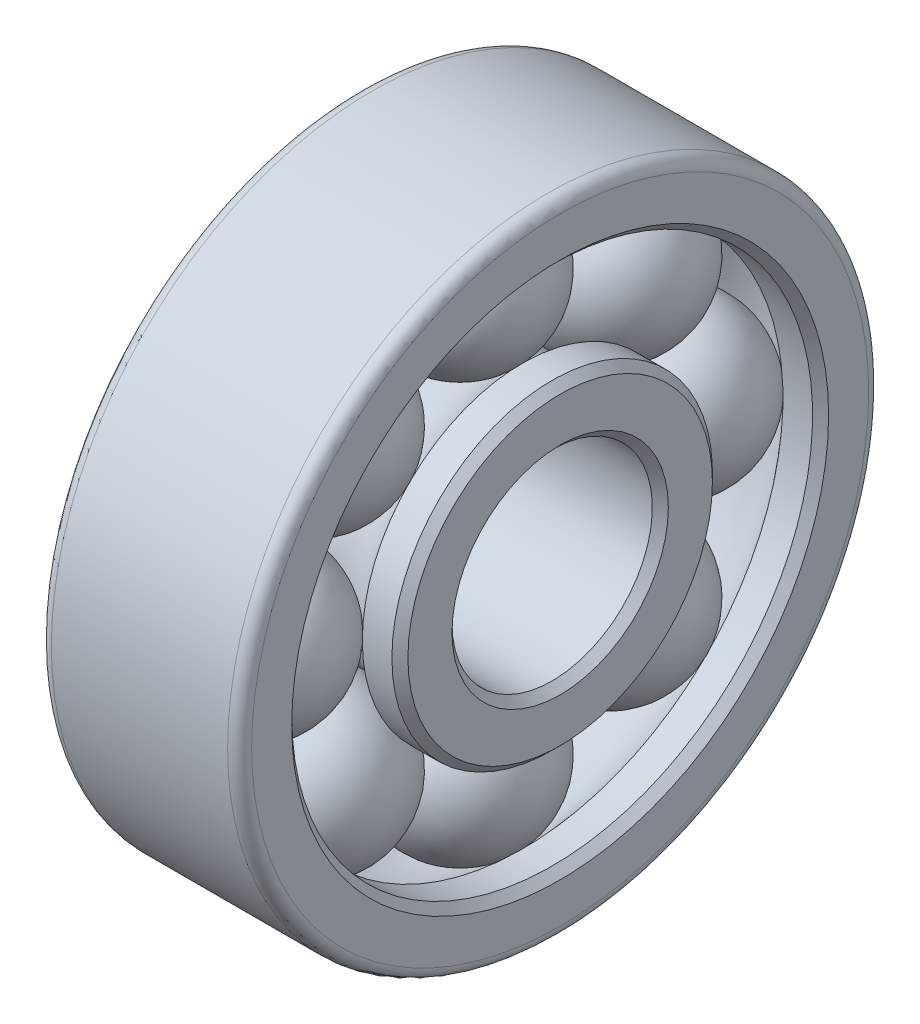
ISO-10303-21;
HEADER;
FILE_DESCRIPTION(('STEP AP214'),'2;1');
FILE_NAME('part.step','',(''),(''),'','','');
FILE_SCHEMA(('AUTOMOTIVE_DESIGN { 1 0 10303 214 1 1 1 1 }'));
ENDSEC;
DATA;
#1=APPLICATION_CONTEXT('core data for automotive mechanical design processes');
#2=APPLICATION_PROTOCOL_DEFINITION('international standard','automotive_design',2000,#1);
#3=PRODUCT_CONTEXT('',#1,'mechanical');
#4=PRODUCT('Part','Part','',(#3));
#5=PRODUCT_RELATED_PRODUCT_CATEGORY('part','',(#4));
#6=PRODUCT_DEFINITION_FORMATION('','',#4);
#7=PRODUCT_DEFINITION_CONTEXT('part definition',#1,'design');
#8=PRODUCT_DEFINITION('design','',#6,#7);
#9=PRODUCT_DEFINITION_SHAPE('','',#8);
#10=(LENGTH_UNIT() NAMED_UNIT(*) SI_UNIT(.MILLI.,.METRE.));
#11=(NAMED_UNIT(*) PLANE_ANGLE_UNIT() SI_UNIT($,.RADIAN.));
#12=(NAMED_UNIT(*) SI_UNIT($,.STERADIAN.) SOLID_ANGLE_UNIT());
#13=UNCERTAINTY_MEASURE_WITH_UNIT(LENGTH_MEASURE(1.E-05),#10,'distance_accuracy_value','');
#14=(GEOMETRIC_REPRESENTATION_CONTEXT(3) GLOBAL_UNCERTAINTY_ASSIGNED_CONTEXT((#13)) GLOBAL_UNIT_ASSIGNED_CONTEXT((#10,
#11,#12)) REPRESENTATION_CONTEXT('',''));
#15=CARTESIAN_POINT('',(0.,0.,0.));
#16=DIRECTION('',(0.,0.,1.));
#17=DIRECTION('',(1.,0.,0.));
#18=AXIS2_PLACEMENT_3D('',#15,#16,#17);
#19=CARTESIAN_POINT('',(2.5,1.21231060122942,3.71231060122933));
#20=DIRECTION('',(0.,0.707106781186556,0.707106781186539));
#21=DIRECTION('',(1.,0.,0.));
#22=AXIS2_PLACEMENT_3D('',#19,#20,#21);
#23=SPHERICAL_SURFACE('',#22,2.);
#24=CARTESIAN_POINT('',(2.5,2.62652416360253,5.12652416360241));
#25=VERTEX_POINT('',#24);
#26=VERTEX_LOOP('',#25);
#27=FACE_BOUND('',#26,.T.);
#28=ADVANCED_FACE('F39',(#27),#23,.T.);
#29=CLOSED_SHELL('',(#28));
#30=MANIFOLD_SOLID_BREP('B2',#29);
#31=CARTESIAN_POINT('',(2.5,-2.49999999999995,5.25));
#32=DIRECTION('',(0.,0.,1.));
#33=DIRECTION('',(1.,0.,0.));
#34=AXIS2_PLACEMENT_3D('',#31,#32,#33);
#35=SPHERICAL_SURFACE('',#34,2.);
#36=CARTESIAN_POINT('',(2.5,-2.49999999999992,7.25));
#37=VERTEX_POINT('',#36);
#38=VERTEX_LOOP('',#37);
#39=FACE_BOUND('',#38,.T.);
#40=ADVANCED_FACE('F59',(#39),#35,.T.);
#41=CLOSED_SHELL('',(#40));
#42=MANIFOLD_SOLID_BREP('B6',#41);
#43=CARTESIAN_POINT('',(2.5,-6.21231060122934,3.71231060122941));
#44=DIRECTION('',(0.,-0.707106781186541,0.707106781186554));
#45=DIRECTION('',(1.,0.,0.));
#46=AXIS2_PLACEMENT_3D('',#43,#44,#45);
#47=SPHERICAL_SURFACE('',#46,2.);
#48=CARTESIAN_POINT('',(2.5,-7.62652416360243,5.12652416360252));
#49=VERTEX_POINT('',#48);
#50=VERTEX_LOOP('',#49);
#51=FACE_BOUND('',#50,.T.);
#52=ADVANCED_FACE('F79',(#51),#47,.T.);
#53=CLOSED_SHELL('',(#52));
#54=MANIFOLD_SOLID_BREP('B35',#53);
#55=CARTESIAN_POINT('',(2.5,-7.75,0.));
#56=DIRECTION('',(0.,-1.,0.));
#57=DIRECTION('',(1.,0.,0.));
#58=AXIS2_PLACEMENT_3D('',#55,#56,#57);
#59=SPHERICAL_SURFACE('',#58,2.);
#60=CARTESIAN_POINT('',(2.5,-9.75,0.));
#61=VERTEX_POINT('',#60);
#62=VERTEX_LOOP('',#61);
#63=FACE_BOUND('',#62,.T.);
#64=ADVANCED_FACE('F99',(#63),#59,.T.);
#65=CLOSED_SHELL('',(#64));
#66=MANIFOLD_SOLID_BREP('B55',#65);
#67=CARTESIAN_POINT('',(2.5,-6.21231060122939,-3.71231060122936));
#68=DIRECTION('',(0.,-0.707106781186551,-0.707106781186544));
#69=DIRECTION('',(1.,0.,0.));
#70=AXIS2_PLACEMENT_3D('',#67,#68,#69);
#71=SPHERICAL_SURFACE('',#70,2.);
#72=CARTESIAN_POINT('',(2.5,-7.6265241636025,-5.12652416360244));
#73=VERTEX_POINT('',#72);
#74=VERTEX_LOOP('',#73);
#75=FACE_BOUND('',#74,.T.);
#76=ADVANCED_FACE('F119',(#75),#71,.T.);
#77=CLOSED_SHELL('',(#76));
#78=MANIFOLD_SOLID_BREP('B75',#77);
#79=CARTESIAN_POINT('',(2.5,-2.50000000000002,-5.25));
#80=DIRECTION('',(0.,0.,-1.));
#81=DIRECTION('',(1.,0.,0.));
#82=AXIS2_PLACEMENT_3D('',#79,#80,#81);
#83=SPHERICAL_SURFACE('',#82,2.);
#84=CARTESIAN_POINT('',(2.5,-2.50000000000003,-7.25));
#85=VERTEX_POINT('',#84);
#86=VERTEX_LOOP('',#85);
#87=FACE_BOUND('',#86,.T.);
#88=ADVANCED_FACE('F139',(#87),#83,.T.);
#89=CLOSED_SHELL('',(#88));
#90=MANIFOLD_SOLID_BREP('B95',#89);
#91=CARTESIAN_POINT('',(2.5,1.21231060122937,-3.71231060122938));
#92=DIRECTION('',(0.,0.707106781186546,-0.707106781186549));
#93=DIRECTION('',(1.,0.,0.));
#94=AXIS2_PLACEMENT_3D('',#91,#92,#93);
#95=SPHERICAL_SURFACE('',#94,2.);
#96=CARTESIAN_POINT('',(2.5,2.62652416360246,-5.12652416360248));
#97=VERTEX_POINT('',#96);
#98=VERTEX_LOOP('',#97);
#99=FACE_BOUND('',#98,.T.);
#100=ADVANCED_FACE('F159',(#99),#95,.T.);
#101=CLOSED_SHELL('',(#100));
#102=MANIFOLD_SOLID_BREP('B115',#101);
#103=CARTESIAN_POINT('',(2.5,2.75,0.));
#104=DIRECTION('',(0.,1.,0.));
#105=DIRECTION('',(1.,0.,0.));
#106=AXIS2_PLACEMENT_3D('',#103,#104,#105);
#107=SPHERICAL_SURFACE('',#106,2.);
#108=CARTESIAN_POINT('',(2.5,4.75,0.));
#109=VERTEX_POINT('',#108);
#110=VERTEX_LOOP('',#109);
#111=FACE_BOUND('',#110,.T.);
#112=ADVANCED_FACE('F181',(#111),#107,.T.);
#113=CLOSED_SHELL('',(#112));
#114=MANIFOLD_SOLID_BREP('B135',#113);
#115=CARTESIAN_POINT('',(0.,4.,0.));
#116=DIRECTION('',(1.,0.,0.));
#117=DIRECTION('',(0.,0.,-1.));
#118=AXIS2_PLACEMENT_3D('',#115,#116,#117);
#119=PLANE('',#118);
#120=CARTESIAN_POINT('',(0.,-2.5,0.));
#121=DIRECTION('',(1.,0.,0.));
#122=DIRECTION('',(0.,0.,-1.));
#123=AXIS2_PLACEMENT_3D('',#120,#121,#122);
#124=CIRCLE('',#123,6.7);
#125=CARTESIAN_POINT('',(0.,-2.5,-6.7));
#126=VERTEX_POINT('',#125);
#127=EDGE_CURVE('E180',#126,#126,#124,.T.);
#128=ORIENTED_EDGE('',*,*,#127,.T.);
#129=EDGE_LOOP('',(#128));
#130=FACE_BOUND('',#129,.T.);
#131=CARTESIAN_POINT('',(0.,-2.5,0.));
#132=DIRECTION('',(1.,0.,0.));
#133=DIRECTION('',(0.,0.,-1.));
#134=AXIS2_PLACEMENT_3D('',#131,#132,#133);
#135=CIRCLE('',#134,7.7);
#136=CARTESIAN_POINT('',(0.,-2.5,-7.7));
#137=VERTEX_POINT('',#136);
#138=EDGE_CURVE('E220',#137,#137,#135,.F.);
#139=ORIENTED_EDGE('',*,*,#138,.T.);
#140=EDGE_LOOP('',(#139));
#141=FACE_BOUND('',#140,.T.);
#142=ADVANCED_FACE('F200',(#130,#141),#119,.F.);
#143=CARTESIAN_POINT('',(-1.0669014084507,-2.5,0.));
#144=DIRECTION('',(-1.,0.,0.));
#145=DIRECTION('',(0.,0.,1.));
#146=AXIS2_PLACEMENT_3D('',#143,#144,#145);
#147=CYLINDRICAL_SURFACE('',#146,6.5);
#148=CARTESIAN_POINT('',(0.200000000000001,-2.5,0.));
#149=DIRECTION('',(1.,0.,0.));
#150=DIRECTION('',(0.,0.,-1.));
#151=AXIS2_PLACEMENT_3D('',#148,#149,#150);
#152=CIRCLE('',#151,6.5);
#153=CARTESIAN_POINT('',(0.200000000000001,-2.5,-6.5));
#154=VERTEX_POINT('',#153);
#155=EDGE_CURVE('E207',#154,#154,#152,.F.);
#156=ORIENTED_EDGE('',*,*,#155,.T.);
#157=EDGE_LOOP('',(#156));
#158=FACE_BOUND('',#157,.T.);
#159=CARTESIAN_POINT('',(0.938750500400401,-2.5,0.));
#160=DIRECTION('',(-1.,0.,0.));
#161=DIRECTION('',(0.,0.,1.));
#162=AXIS2_PLACEMENT_3D('',#159,#160,#161);
#163=CIRCLE('',#162,6.5);
#164=CARTESIAN_POINT('',(0.938750500400401,-2.5,6.5));
#165=VERTEX_POINT('',#164);
#166=EDGE_CURVE('E232',#165,#165,#163,.T.);
#167=ORIENTED_EDGE('',*,*,#166,.F.);
#168=EDGE_LOOP('',(#167));
#169=FACE_BOUND('',#168,.T.);
#170=ADVANCED_FACE('F244',(#158,#169),#147,.F.);
#171=CARTESIAN_POINT('',(2.5,-2.5,0.));
#172=DIRECTION('',(-1.,0.,0.));
#173=DIRECTION('',(0.,0.,1.));
#174=AXIS2_PLACEMENT_3D('',#171,#172,#173);
#175=TOROIDAL_SURFACE('',#174,5.25,2.);
#176=CARTESIAN_POINT('',(4.0612494995996,-2.5,0.));
#177=DIRECTION('',(-1.,0.,0.));
#178=DIRECTION('',(0.,0.,1.));
#179=AXIS2_PLACEMENT_3D('',#176,#177,#178);
#180=CIRCLE('',#179,6.5);
#181=CARTESIAN_POINT('',(4.0612494995996,-2.5,6.5));
#182=VERTEX_POINT('',#181);
#183=EDGE_CURVE('E235',#182,#182,#180,.T.);
#184=ORIENTED_EDGE('',*,*,#183,.F.);
#185=EDGE_LOOP('',(#184));
#186=FACE_BOUND('',#185,.T.);
#187=ORIENTED_EDGE('',*,*,#166,.T.);
#188=EDGE_LOOP('',(#187));
#189=FACE_BOUND('',#188,.T.);
#190=ADVANCED_FACE('F241',(#186,#189),#175,.F.);
#191=CARTESIAN_POINT('',(-1.0669014084507,-2.5,0.));
#192=DIRECTION('',(-1.,0.,0.));
#193=DIRECTION('',(0.,0.,1.));
#194=AXIS2_PLACEMENT_3D('',#191,#192,#193);
#195=CYLINDRICAL_SURFACE('',#194,6.5);
#196=CARTESIAN_POINT('',(4.8,-2.5,0.));
#197=DIRECTION('',(-1.,0.,0.));
#198=DIRECTION('',(0.,0.,1.));
#199=AXIS2_PLACEMENT_3D('',#196,#197,#198);
#200=CIRCLE('',#199,6.5);
#201=CARTESIAN_POINT('',(4.8,-2.5,6.5));
#202=VERTEX_POINT('',#201);
#203=EDGE_CURVE('E211',#202,#202,#200,.F.);
#204=ORIENTED_EDGE('',*,*,#203,.T.);
#205=EDGE_LOOP('',(#204));
#206=FACE_BOUND('',#205,.T.);
#207=ORIENTED_EDGE('',*,*,#183,.T.);
#208=EDGE_LOOP('',(#207));
#209=FACE_BOUND('',#208,.T.);
#210=ADVANCED_FACE('F239',(#206,#209),#195,.F.);
#211=CARTESIAN_POINT('',(5.,4.,0.));
#212=DIRECTION('',(-1.,0.,0.));
#213=DIRECTION('',(0.,0.,1.));
#214=AXIS2_PLACEMENT_3D('',#211,#212,#213);
#215=PLANE('',#214);
#216=CARTESIAN_POINT('',(5.,-2.5,0.));
#217=DIRECTION('',(-1.,0.,0.));
#218=DIRECTION('',(0.,0.,1.));
#219=AXIS2_PLACEMENT_3D('',#216,#217,#218);
#220=CIRCLE('',#219,6.7);
#221=CARTESIAN_POINT('',(5.,-2.5,6.7));
#222=VERTEX_POINT('',#221);
#223=EDGE_CURVE('E215',#222,#222,#220,.T.);
#224=ORIENTED_EDGE('',*,*,#223,.T.);
#225=EDGE_LOOP('',(#224));
#226=FACE_BOUND('',#225,.T.);
#227=CARTESIAN_POINT('',(5.,-2.5,0.));
#228=DIRECTION('',(-1.,0.,0.));
#229=DIRECTION('',(0.,0.,1.));
#230=AXIS2_PLACEMENT_3D('',#227,#228,#229);
#231=CIRCLE('',#230,7.7);
#232=CARTESIAN_POINT('',(5.,-2.5,7.7));
#233=VERTEX_POINT('',#232);
#234=EDGE_CURVE('E223',#233,#233,#231,.F.);
#235=ORIENTED_EDGE('',*,*,#234,.T.);
#236=EDGE_LOOP('',(#235));
#237=FACE_BOUND('',#236,.T.);
#238=ADVANCED_FACE('F275',(#226,#237),#215,.F.);
#239=CARTESIAN_POINT('',(-1.0669014084507,-2.5,0.));
#240=DIRECTION('',(-1.,0.,0.));
#241=DIRECTION('',(0.,0.,1.));
#242=AXIS2_PLACEMENT_3D('',#239,#240,#241);
#243=CYLINDRICAL_SURFACE('',#242,8.);
#244=CARTESIAN_POINT('',(4.7,-2.5,0.));
#245=DIRECTION('',(-1.,0.,0.));
#246=DIRECTION('',(0.,0.,1.));
#247=AXIS2_PLACEMENT_3D('',#244,#245,#246);
#248=CIRCLE('',#247,8.);
#249=CARTESIAN_POINT('',(4.7,-2.5,8.));
#250=VERTEX_POINT('',#249);
#251=EDGE_CURVE('E226',#250,#250,#248,.T.);
#252=ORIENTED_EDGE('',*,*,#251,.T.);
#253=EDGE_LOOP('',(#252));
#254=FACE_BOUND('',#253,.T.);
#255=CARTESIAN_POINT('',(0.3,-2.5,0.));
#256=DIRECTION('',(1.,0.,0.));
#257=DIRECTION('',(0.,0.,-1.));
#258=AXIS2_PLACEMENT_3D('',#255,#256,#257);
#259=CIRCLE('',#258,8.);
#260=CARTESIAN_POINT('',(0.3,-2.5,-8.));
#261=VERTEX_POINT('',#260);
#262=EDGE_CURVE('E229',#261,#261,#259,.T.);
#263=ORIENTED_EDGE('',*,*,#262,.T.);
#264=EDGE_LOOP('',(#263));
#265=FACE_BOUND('',#264,.T.);
#266=ADVANCED_FACE('F260',(#254,#265),#243,.T.);
#267=CARTESIAN_POINT('',(4.7,-2.5,0.));
#268=DIRECTION('',(-1.,0.,0.));
#269=DIRECTION('',(0.,0.,1.));
#270=AXIS2_PLACEMENT_3D('',#267,#268,#269);
#271=TOROIDAL_SURFACE('',#270,7.7,0.3);
#272=ORIENTED_EDGE('',*,*,#234,.F.);
#273=EDGE_LOOP('',(#272));
#274=FACE_BOUND('',#273,.T.);
#275=ORIENTED_EDGE('',*,*,#251,.F.);
#276=EDGE_LOOP('',(#275));
#277=FACE_BOUND('',#276,.T.);
#278=ADVANCED_FACE('F256',(#274,#277),#271,.T.);
#279=CARTESIAN_POINT('',(0.3,-2.5,0.));
#280=DIRECTION('',(1.,0.,0.));
#281=DIRECTION('',(0.,0.,-1.));
#282=AXIS2_PLACEMENT_3D('',#279,#280,#281);
#283=TOROIDAL_SURFACE('',#282,7.7,0.3);
#284=ORIENTED_EDGE('',*,*,#262,.F.);
#285=EDGE_LOOP('',(#284));
#286=FACE_BOUND('',#285,.T.);
#287=ORIENTED_EDGE('',*,*,#138,.F.);
#288=EDGE_LOOP('',(#287));
#289=FACE_BOUND('',#288,.T.);
#290=ADVANCED_FACE('F259',(#286,#289),#283,.T.);
#291=CARTESIAN_POINT('',(5.,-2.5,0.));
#292=DIRECTION('',(1.,0.,0.));
#293=DIRECTION('',(0.,0.,-1.));
#294=AXIS2_PLACEMENT_3D('',#291,#292,#293);
#295=CONICAL_SURFACE('',#294,6.7,0.78539816339744);
#296=ORIENTED_EDGE('',*,*,#203,.F.);
#297=EDGE_LOOP('',(#296));
#298=FACE_BOUND('',#297,.T.);
#299=ORIENTED_EDGE('',*,*,#223,.F.);
#300=EDGE_LOOP('',(#299));
#301=FACE_BOUND('',#300,.T.);
#302=ADVANCED_FACE('F263',(#298,#301),#295,.F.);
#303=CARTESIAN_POINT('',(0.200000000000001,-2.5,0.));
#304=DIRECTION('',(-1.,0.,0.));
#305=DIRECTION('',(0.,0.,1.));
#306=AXIS2_PLACEMENT_3D('',#303,#304,#305);
#307=CONICAL_SURFACE('',#306,6.5,0.785398163397446);
#308=ORIENTED_EDGE('',*,*,#127,.F.);
#309=EDGE_LOOP('',(#308));
#310=FACE_BOUND('',#309,.T.);
#311=ORIENTED_EDGE('',*,*,#155,.F.);
#312=EDGE_LOOP('',(#311));
#313=FACE_BOUND('',#312,.T.);
#314=ADVANCED_FACE('F202',(#310,#313),#307,.F.);
#315=CLOSED_SHELL('',(#142,#170,#190,#210,#238,#266,#278,#290,#302,#314));
#316=MANIFOLD_SOLID_BREP('B155',#315);
#317=CARTESIAN_POINT('',(0.,0.,0.));
#318=DIRECTION('',(1.,0.,0.));
#319=DIRECTION('',(0.,0.,-1.));
#320=AXIS2_PLACEMENT_3D('',#317,#318,#319);
#321=PLANE('',#320);
#322=CARTESIAN_POINT('',(0.,-2.5,0.));
#323=DIRECTION('',(1.,0.,0.));
#324=DIRECTION('',(0.,0.,-1.));
#325=AXIS2_PLACEMENT_3D('',#322,#323,#324);
#326=CIRCLE('',#325,2.7);
#327=CARTESIAN_POINT('',(0.,-2.5,2.7));
#328=VERTEX_POINT('',#327);
#329=EDGE_CURVE('E375',#328,#328,#326,.T.);
#330=ORIENTED_EDGE('',*,*,#329,.T.);
#331=EDGE_LOOP('',(#330));
#332=FACE_BOUND('',#331,.T.);
#333=CARTESIAN_POINT('',(0.,-2.5,0.));
#334=DIRECTION('',(1.,0.,0.));
#335=DIRECTION('',(0.,0.,-1.));
#336=AXIS2_PLACEMENT_3D('',#333,#334,#335);
#337=CIRCLE('',#336,3.8);
#338=CARTESIAN_POINT('',(0.,-2.5,-3.8));
#339=VERTEX_POINT('',#338);
#340=EDGE_CURVE('E378',#339,#339,#337,.F.);
#341=ORIENTED_EDGE('',*,*,#340,.T.);
#342=EDGE_LOOP('',(#341));
#343=FACE_BOUND('',#342,.T.);
#344=ADVANCED_FACE('F355',(#332,#343),#321,.F.);
#345=CARTESIAN_POINT('',(-1.0669014084507,-2.5,0.));
#346=DIRECTION('',(-1.,0.,0.));
#347=DIRECTION('',(0.,0.,1.));
#348=AXIS2_PLACEMENT_3D('',#345,#346,#347);
#349=CYLINDRICAL_SURFACE('',#348,2.5);
#350=CARTESIAN_POINT('',(0.199999999999994,-2.5,0.));
#351=DIRECTION('',(1.,0.,0.));
#352=DIRECTION('',(0.,0.,-1.));
#353=AXIS2_PLACEMENT_3D('',#350,#351,#352);
#354=CIRCLE('',#353,2.5);
#355=CARTESIAN_POINT('',(0.199999999999994,-2.5,2.5));
#356=VERTEX_POINT('',#355);
#357=EDGE_CURVE('E381',#356,#356,#354,.F.);
#358=ORIENTED_EDGE('',*,*,#357,.T.);
#359=EDGE_LOOP('',(#358));
#360=FACE_BOUND('',#359,.T.);
#361=CARTESIAN_POINT('',(4.8,-2.5,0.));
#362=DIRECTION('',(-1.,0.,0.));
#363=DIRECTION('',(0.,0.,1.));
#364=AXIS2_PLACEMENT_3D('',#361,#362,#363);
#365=CIRCLE('',#364,2.5);
#366=CARTESIAN_POINT('',(4.8,-2.5,2.5));
#367=VERTEX_POINT('',#366);
#368=EDGE_CURVE('E384',#367,#367,#365,.F.);
#369=ORIENTED_EDGE('',*,*,#368,.T.);
#370=EDGE_LOOP('',(#369));
#371=FACE_BOUND('',#370,.T.);
#372=ADVANCED_FACE('F409',(#360,#371),#349,.F.);
#373=CARTESIAN_POINT('',(5.,0.,0.));
#374=DIRECTION('',(-1.,0.,0.));
#375=DIRECTION('',(0.,0.,1.));
#376=AXIS2_PLACEMENT_3D('',#373,#374,#375);
#377=PLANE('',#376);
#378=CARTESIAN_POINT('',(5.,-2.5,0.));
#379=DIRECTION('',(-1.,0.,0.));
#380=DIRECTION('',(0.,0.,1.));
#381=AXIS2_PLACEMENT_3D('',#378,#379,#380);
#382=CIRCLE('',#381,2.7);
#383=CARTESIAN_POINT('',(5.,-2.5,2.7));
#384=VERTEX_POINT('',#383);
#385=EDGE_CURVE('E366',#384,#384,#382,.T.);
#386=ORIENTED_EDGE('',*,*,#385,.T.);
#387=EDGE_LOOP('',(#386));
#388=FACE_BOUND('',#387,.T.);
#389=CARTESIAN_POINT('',(5.,-2.5,0.));
#390=DIRECTION('',(-1.,0.,0.));
#391=DIRECTION('',(0.,0.,1.));
#392=AXIS2_PLACEMENT_3D('',#389,#390,#391);
#393=CIRCLE('',#392,3.8);
#394=CARTESIAN_POINT('',(5.,-2.5,3.8));
#395=VERTEX_POINT('',#394);
#396=EDGE_CURVE('E370',#395,#395,#393,.F.);
#397=ORIENTED_EDGE('',*,*,#396,.T.);
#398=EDGE_LOOP('',(#397));
#399=FACE_BOUND('',#398,.T.);
#400=ADVANCED_FACE('F404',(#388,#399),#377,.F.);
#401=CARTESIAN_POINT('',(-1.0669014084507,-2.5,0.));
#402=DIRECTION('',(-1.,0.,0.));
#403=DIRECTION('',(0.,0.,1.));
#404=AXIS2_PLACEMENT_3D('',#401,#402,#403);
#405=CYLINDRICAL_SURFACE('',#404,4.);
#406=CARTESIAN_POINT('',(4.8,-2.5,0.));
#407=DIRECTION('',(-1.,0.,0.));
#408=DIRECTION('',(0.,0.,1.));
#409=AXIS2_PLACEMENT_3D('',#406,#407,#408);
#410=CIRCLE('',#409,4.);
#411=CARTESIAN_POINT('',(4.8,-2.5,4.));
#412=VERTEX_POINT('',#411);
#413=EDGE_CURVE('E362',#412,#412,#410,.T.);
#414=ORIENTED_EDGE('',*,*,#413,.T.);
#415=EDGE_LOOP('',(#414));
#416=FACE_BOUND('',#415,.T.);
#417=CARTESIAN_POINT('',(4.0612494995996,-2.5,0.));
#418=DIRECTION('',(-1.,0.,0.));
#419=DIRECTION('',(0.,0.,1.));
#420=AXIS2_PLACEMENT_3D('',#417,#418,#419);
#421=CIRCLE('',#420,4.);
#422=CARTESIAN_POINT('',(4.0612494995996,-2.5,4.));
#423=VERTEX_POINT('',#422);
#424=EDGE_CURVE('E387',#423,#423,#421,.T.);
#425=ORIENTED_EDGE('',*,*,#424,.F.);
#426=EDGE_LOOP('',(#425));
#427=FACE_BOUND('',#426,.T.);
#428=ADVANCED_FACE('F399',(#416,#427),#405,.T.);
#429=CARTESIAN_POINT('',(2.5,-2.5,0.));
#430=DIRECTION('',(-1.,0.,0.));
#431=DIRECTION('',(0.,0.,1.));
#432=AXIS2_PLACEMENT_3D('',#429,#430,#431);
#433=TOROIDAL_SURFACE('',#432,5.25,2.);
#434=CARTESIAN_POINT('',(0.938750500400399,-2.5,0.));
#435=DIRECTION('',(-1.,0.,0.));
#436=DIRECTION('',(0.,0.,1.));
#437=AXIS2_PLACEMENT_3D('',#434,#435,#436);
#438=CIRCLE('',#437,4.);
#439=CARTESIAN_POINT('',(0.938750500400399,-2.5,4.));
#440=VERTEX_POINT('',#439);
#441=EDGE_CURVE('E390',#440,#440,#438,.T.);
#442=ORIENTED_EDGE('',*,*,#441,.F.);
#443=EDGE_LOOP('',(#442));
#444=FACE_BOUND('',#443,.T.);
#445=ORIENTED_EDGE('',*,*,#424,.T.);
#446=EDGE_LOOP('',(#445));
#447=FACE_BOUND('',#446,.T.);
#448=ADVANCED_FACE('F396',(#444,#447),#433,.F.);
#449=CARTESIAN_POINT('',(-1.0669014084507,-2.5,0.));
#450=DIRECTION('',(-1.,0.,0.));
#451=DIRECTION('',(0.,0.,1.));
#452=AXIS2_PLACEMENT_3D('',#449,#450,#451);
#453=CYLINDRICAL_SURFACE('',#452,4.);
#454=CARTESIAN_POINT('',(0.200000000000001,-2.5,0.));
#455=DIRECTION('',(1.,0.,0.));
#456=DIRECTION('',(0.,0.,-1.));
#457=AXIS2_PLACEMENT_3D('',#454,#455,#456);
#458=CIRCLE('',#457,4.);
#459=CARTESIAN_POINT('',(0.200000000000001,-2.5,-4.));
#460=VERTEX_POINT('',#459);
#461=EDGE_CURVE('E199',#460,#460,#458,.T.);
#462=ORIENTED_EDGE('',*,*,#461,.T.);
#463=EDGE_LOOP('',(#462));
#464=FACE_BOUND('',#463,.T.);
#465=ORIENTED_EDGE('',*,*,#441,.T.);
#466=EDGE_LOOP('',(#465));
#467=FACE_BOUND('',#466,.T.);
#468=ADVANCED_FACE('F394',(#464,#467),#453,.T.);
#469=CARTESIAN_POINT('',(0.199999999999994,-2.5,0.));
#470=DIRECTION('',(-1.,0.,0.));
#471=DIRECTION('',(0.,0.,1.));
#472=AXIS2_PLACEMENT_3D('',#469,#470,#471);
#473=CONICAL_SURFACE('',#472,2.5,0.785398163397453);
#474=CARTESIAN_POINT('',(0.,-2.5,2.7));
#475=CARTESIAN_POINT('',(0.00208333333333319,-2.5,2.69791666666666));
#476=CARTESIAN_POINT('',(0.00416666666666648,-2.5,2.69583333333333));
#477=CARTESIAN_POINT('',(0.00833333333333306,-2.5,2.69166666666666));
#478=CARTESIAN_POINT('',(0.0104166666666664,-2.5,2.68958333333333));
#479=CARTESIAN_POINT('',(0.0145833333333329,-2.5,2.68541666666666));
#480=CARTESIAN_POINT('',(0.0166666666666661,-2.5,2.68333333333333));
#481=CARTESIAN_POINT('',(0.0208333333333326,-2.5,2.67916666666666));
#482=CARTESIAN_POINT('',(0.0229166666666659,-2.5,2.67708333333333));
#483=CARTESIAN_POINT('',(0.0270833333333324,-2.5,2.67291666666666));
#484=CARTESIAN_POINT('',(0.0291666666666657,-2.5,2.67083333333333));
#485=CARTESIAN_POINT('',(0.0333333333333322,-2.5,2.66666666666666));
#486=CARTESIAN_POINT('',(0.0354166666666655,-2.5,2.66458333333333));
#487=CARTESIAN_POINT('',(0.0395833333333321,-2.5,2.66041666666666));
#488=CARTESIAN_POINT('',(0.0416666666666653,-2.5,2.65833333333333));
#489=CARTESIAN_POINT('',(0.0458333333333318,-2.5,2.65416666666666));
#490=CARTESIAN_POINT('',(0.0479166666666651,-2.5,2.65208333333333));
#491=CARTESIAN_POINT('',(0.0520833333333316,-2.5,2.64791666666666));
#492=CARTESIAN_POINT('',(0.0541666666666649,-2.5,2.64583333333333));
#493=CARTESIAN_POINT('',(0.0583333333333314,-2.5,2.64166666666666));
#494=CARTESIAN_POINT('',(0.0604166666666648,-2.5,2.63958333333333));
#495=CARTESIAN_POINT('',(0.0645833333333313,-2.5,2.63541666666666));
#496=CARTESIAN_POINT('',(0.0666666666666645,-2.5,2.63333333333333));
#497=CARTESIAN_POINT('',(0.070833333333331,-2.5,2.62916666666666));
#498=CARTESIAN_POINT('',(0.0729166666666643,-2.5,2.62708333333333));
#499=CARTESIAN_POINT('',(0.0770833333333309,-2.5,2.62291666666666));
#500=CARTESIAN_POINT('',(0.0791666666666641,-2.5,2.62083333333333));
#501=CARTESIAN_POINT('',(0.0833333333333307,-2.5,2.61666666666666));
#502=CARTESIAN_POINT('',(0.0854166666666639,-2.5,2.61458333333333));
#503=CARTESIAN_POINT('',(0.0895833333333305,-2.5,2.61041666666666));
#504=CARTESIAN_POINT('',(0.0916666666666637,-2.5,2.60833333333333));
#505=CARTESIAN_POINT('',(0.0958333333333302,-2.5,2.60416666666666));
#506=CARTESIAN_POINT('',(0.0979166666666635,-2.5,2.60208333333333));
#507=CARTESIAN_POINT('',(0.10208333333333,-2.5,2.59791666666667));
#508=CARTESIAN_POINT('',(0.104166666666663,-2.5,2.59583333333333));
#509=CARTESIAN_POINT('',(0.10833333333333,-2.5,2.59166666666667));
#510=CARTESIAN_POINT('',(0.110416666666663,-2.5,2.58958333333333));
#511=CARTESIAN_POINT('',(0.11458333333333,-2.5,2.58541666666666));
#512=CARTESIAN_POINT('',(0.116666666666663,-2.5,2.58333333333333));
#513=CARTESIAN_POINT('',(0.120833333333329,-2.5,2.57916666666667));
#514=CARTESIAN_POINT('',(0.122916666666663,-2.5,2.57708333333333));
#515=CARTESIAN_POINT('',(0.127083333333329,-2.5,2.57291666666667));
#516=CARTESIAN_POINT('',(0.129166666666663,-2.5,2.57083333333333));
#517=CARTESIAN_POINT('',(0.133333333333329,-2.5,2.56666666666667));
#518=CARTESIAN_POINT('',(0.135416666666662,-2.5,2.56458333333333));
#519=CARTESIAN_POINT('',(0.139583333333329,-2.5,2.56041666666667));
#520=CARTESIAN_POINT('',(0.141666666666662,-2.5,2.55833333333333));
#521=CARTESIAN_POINT('',(0.145833333333329,-2.5,2.55416666666667));
#522=CARTESIAN_POINT('',(0.147916666666662,-2.5,2.55208333333333));
#523=CARTESIAN_POINT('',(0.152083333333328,-2.5,2.54791666666667));
#524=CARTESIAN_POINT('',(0.154166666666662,-2.5,2.54583333333333));
#525=CARTESIAN_POINT('',(0.158333333333328,-2.5,2.54166666666667));
#526=CARTESIAN_POINT('',(0.160416666666662,-2.5,2.53958333333333));
#527=CARTESIAN_POINT('',(0.164583333333328,-2.5,2.53541666666667));
#528=CARTESIAN_POINT('',(0.166666666666661,-2.5,2.53333333333333));
#529=CARTESIAN_POINT('',(0.170833333333328,-2.5,2.52916666666667));
#530=CARTESIAN_POINT('',(0.172916666666661,-2.5,2.52708333333333));
#531=CARTESIAN_POINT('',(0.177083333333328,-2.5,2.52291666666667));
#532=CARTESIAN_POINT('',(0.179166666666661,-2.5,2.52083333333333));
#533=CARTESIAN_POINT('',(0.183333333333327,-2.5,2.51666666666667));
#534=CARTESIAN_POINT('',(0.185416666666661,-2.5,2.51458333333333));
#535=CARTESIAN_POINT('',(0.189583333333327,-2.5,2.51041666666667));
#536=CARTESIAN_POINT('',(0.19166666666666,-2.5,2.50833333333333));
#537=CARTESIAN_POINT('',(0.195833333333327,-2.5,2.50416666666667));
#538=CARTESIAN_POINT('',(0.19791666666666,-2.5,2.50208333333333));
#539=CARTESIAN_POINT('',(0.199999999999994,-2.5,2.5));
#540=B_SPLINE_CURVE_WITH_KNOTS('',3,(#474,#475,#476,#477,#478,#479,#480,#481,#482,#483,#484,
#485,#486,#487,#488,#489,#490,#491,#492,#493,#494,#495,#496,#497,#498,#499,#500,#501,#502,#503,
#504,#505,#506,#507,#508,#509,#510,#511,#512,#513,#514,#515,#516,#517,#518,#519,#520,#521,#522,
#523,#524,#525,#526,#527,#528,#529,#530,#531,#532,#533,#534,#535,#536,#537,#538,#539),
.UNSPECIFIED.,.F.,.F.,(4,2,2,2,2,2,2,2,2,2,2,2,2,2,2,2,2,2,2,2,2,2,2,2,2,2,2,2,2,2,2,2,4),(0.,
0.00883883476483152,0.017677669529663,0.0265165042944949,0.0353553390593264,0.0441941738241579,
0.0530330085889894,0.0618718433538213,0.0707106781186528,0.0795495128834843,0.0883883476483158,
0.0972271824131477,0.106066017177979,0.114904851942811,0.123743686707642,0.132582521472474,
0.141421356237306,0.150260191002137,0.159099025766969,0.1679378605318,0.176776695296632,
0.185615530061464,0.194454364826295,0.203293199591127,0.212132034355958,0.22097086912079,
0.229809703885621,0.238648538650453,0.247487373415285,0.256326208180116,0.265165042944948,
0.27400387770978,0.282842712474611),.UNSPECIFIED.);
#541=EDGE_CURVE('BSEAM422',#328,#356,#540,.T.);
#542=ORIENTED_EDGE('',*,*,#329,.F.);
#543=ORIENTED_EDGE('',*,*,#357,.F.);
#544=ORIENTED_EDGE('',*,*,#541,.T.);
#545=ORIENTED_EDGE('',*,*,#541,.F.);
#546=EDGE_LOOP('',(#542,#544,#543,#545));
#547=FACE_BOUND('',#546,.T.);
#548=ADVANCED_FACE('F422',(#547),#473,.F.);
#549=CARTESIAN_POINT('',(5.,-2.5,0.));
#550=DIRECTION('',(1.,0.,0.));
#551=DIRECTION('',(0.,0.,-1.));
#552=AXIS2_PLACEMENT_3D('',#549,#550,#551);
#553=CONICAL_SURFACE('',#552,2.7,0.785398163397442);
#554=ORIENTED_EDGE('',*,*,#368,.F.);
#555=EDGE_LOOP('',(#554));
#556=FACE_BOUND('',#555,.T.);
#557=ORIENTED_EDGE('',*,*,#385,.F.);
#558=EDGE_LOOP('',(#557));
#559=FACE_BOUND('',#558,.T.);
#560=ADVANCED_FACE('F425',(#556,#559),#553,.F.);
#561=CARTESIAN_POINT('',(4.8,-2.5,0.));
#562=DIRECTION('',(-1.,0.,0.));
#563=DIRECTION('',(0.,0.,1.));
#564=AXIS2_PLACEMENT_3D('',#561,#562,#563);
#565=CONICAL_SURFACE('',#564,4.,0.78539816339745);
#566=CARTESIAN_POINT('',(5.,-2.5,3.8));
#567=CARTESIAN_POINT('',(4.99791666666667,-2.5,3.80208333333333));
#568=CARTESIAN_POINT('',(4.99583333333333,-2.5,3.80416666666667));
#569=CARTESIAN_POINT('',(4.99166666666667,-2.5,3.80833333333333));
#570=CARTESIAN_POINT('',(4.98958333333333,-2.5,3.81041666666667));
#571=CARTESIAN_POINT('',(4.98541666666667,-2.5,3.81458333333333));
#572=CARTESIAN_POINT('',(4.98333333333333,-2.5,3.81666666666667));
#573=CARTESIAN_POINT('',(4.97916666666667,-2.5,3.82083333333333));
#574=CARTESIAN_POINT('',(4.97708333333333,-2.5,3.82291666666667));
#575=CARTESIAN_POINT('',(4.97291666666667,-2.5,3.82708333333333));
#576=CARTESIAN_POINT('',(4.97083333333333,-2.5,3.82916666666667));
#577=CARTESIAN_POINT('',(4.96666666666667,-2.5,3.83333333333333));
#578=CARTESIAN_POINT('',(4.96458333333333,-2.5,3.83541666666667));
#579=CARTESIAN_POINT('',(4.96041666666667,-2.5,3.83958333333333));
#580=CARTESIAN_POINT('',(4.95833333333333,-2.5,3.84166666666667));
#581=CARTESIAN_POINT('',(4.95416666666667,-2.5,3.84583333333333));
#582=CARTESIAN_POINT('',(4.95208333333333,-2.5,3.84791666666667));
#583=CARTESIAN_POINT('',(4.94791666666667,-2.5,3.85208333333333));
#584=CARTESIAN_POINT('',(4.94583333333333,-2.5,3.85416666666667));
#585=CARTESIAN_POINT('',(4.94166666666667,-2.5,3.85833333333333));
#586=CARTESIAN_POINT('',(4.93958333333333,-2.5,3.86041666666667));
#587=CARTESIAN_POINT('',(4.93541666666667,-2.5,3.86458333333333));
#588=CARTESIAN_POINT('',(4.93333333333333,-2.5,3.86666666666667));
#589=CARTESIAN_POINT('',(4.92916666666667,-2.5,3.87083333333333));
#590=CARTESIAN_POINT('',(4.92708333333333,-2.5,3.87291666666667));
#591=CARTESIAN_POINT('',(4.92291666666667,-2.5,3.87708333333333));
#592=CARTESIAN_POINT('',(4.92083333333333,-2.5,3.87916666666667));
#593=CARTESIAN_POINT('',(4.91666666666667,-2.5,3.88333333333333));
#594=CARTESIAN_POINT('',(4.91458333333333,-2.5,3.88541666666667));
#595=CARTESIAN_POINT('',(4.91041666666667,-2.5,3.88958333333333));
#596=CARTESIAN_POINT('',(4.90833333333333,-2.5,3.89166666666667));
#597=CARTESIAN_POINT('',(4.90416666666667,-2.5,3.89583333333333));
#598=CARTESIAN_POINT('',(4.90208333333333,-2.5,3.89791666666667));
#599=CARTESIAN_POINT('',(4.89791666666667,-2.5,3.90208333333333));
#600=CARTESIAN_POINT('',(4.89583333333333,-2.5,3.90416666666667));
#601=CARTESIAN_POINT('',(4.89166666666667,-2.5,3.90833333333333));
#602=CARTESIAN_POINT('',(4.88958333333333,-2.5,3.91041666666667));
#603=CARTESIAN_POINT('',(4.88541666666667,-2.5,3.91458333333333));
#604=CARTESIAN_POINT('',(4.88333333333333,-2.5,3.91666666666667));
#605=CARTESIAN_POINT('',(4.87916666666667,-2.5,3.92083333333333));
#606=CARTESIAN_POINT('',(4.87708333333333,-2.5,3.92291666666667));
#607=CARTESIAN_POINT('',(4.87291666666667,-2.5,3.92708333333333));
#608=CARTESIAN_POINT('',(4.87083333333333,-2.5,3.92916666666667));
#609=CARTESIAN_POINT('',(4.86666666666667,-2.5,3.93333333333333));
#610=CARTESIAN_POINT('',(4.86458333333333,-2.5,3.93541666666667));
#611=CARTESIAN_POINT('',(4.86041666666667,-2.5,3.93958333333333));
#612=CARTESIAN_POINT('',(4.85833333333333,-2.5,3.94166666666667));
#613=CARTESIAN_POINT('',(4.85416666666667,-2.5,3.94583333333333));
#614=CARTESIAN_POINT('',(4.85208333333333,-2.5,3.94791666666667));
#615=CARTESIAN_POINT('',(4.84791666666667,-2.5,3.95208333333333));
#616=CARTESIAN_POINT('',(4.84583333333333,-2.5,3.95416666666667));
#617=CARTESIAN_POINT('',(4.84166666666667,-2.5,3.95833333333333));
#618=CARTESIAN_POINT('',(4.83958333333333,-2.5,3.96041666666667));
#619=CARTESIAN_POINT('',(4.83541666666667,-2.5,3.96458333333333));
#620=CARTESIAN_POINT('',(4.83333333333333,-2.5,3.96666666666667));
#621=CARTESIAN_POINT('',(4.82916666666667,-2.5,3.97083333333333));
#622=CARTESIAN_POINT('',(4.82708333333333,-2.5,3.97291666666667));
#623=CARTESIAN_POINT('',(4.82291666666667,-2.5,3.97708333333333));
#624=CARTESIAN_POINT('',(4.82083333333333,-2.5,3.97916666666667));
#625=CARTESIAN_POINT('',(4.81666666666667,-2.5,3.98333333333333));
#626=CARTESIAN_POINT('',(4.81458333333333,-2.5,3.98541666666667));
#627=CARTESIAN_POINT('',(4.81041666666667,-2.5,3.98958333333333));
#628=CARTESIAN_POINT('',(4.80833333333333,-2.5,3.99166666666667));
#629=CARTESIAN_POINT('',(4.80416666666667,-2.5,3.99583333333333));
#630=CARTESIAN_POINT('',(4.80208333333333,-2.5,3.99791666666667));
#631=CARTESIAN_POINT('',(4.8,-2.5,4.));
#632=B_SPLINE_CURVE_WITH_KNOTS('',3,(#566,#567,#568,#569,#570,#571,#572,#573,#574,#575,#576,
#577,#578,#579,#580,#581,#582,#583,#584,#585,#586,#587,#588,#589,#590,#591,#592,#593,#594,#595,
#596,#597,#598,#599,#600,#601,#602,#603,#604,#605,#606,#607,#608,#609,#610,#611,#612,#613,#614,
#615,#616,#617,#618,#619,#620,#621,#622,#623,#624,#625,#626,#627,#628,#629,#630,#631),
.UNSPECIFIED.,.F.,.F.,(4,2,2,2,2,2,2,2,2,2,2,2,2,2,2,2,2,2,2,2,2,2,2,2,2,2,2,2,2,2,2,2,4),(0.,
0.00883883476483148,0.0176776695296633,0.0265165042944954,0.0353553390593275,0.0441941738241586,
0.0530330085889907,0.0618718433538225,0.0707106781186546,0.0795495128834867,0.0883883476483179,
0.09722718241315,0.106066017177982,0.114904851942814,0.123743686707645,0.132582521472477,
0.141421356237309,0.150260191002141,0.159099025766973,0.167937860531805,0.176776695296637,
0.185615530061469,0.1944543648263,0.203293199591132,0.212132034355964,0.220970869120796,
0.229809703885628,0.23864853865046,0.247487373415291,0.256326208180123,0.265165042944955,
0.274003877709787,0.282842712474619),.UNSPECIFIED.);
#633=EDGE_CURVE('BSEAM428',#395,#412,#632,.T.);
#634=ORIENTED_EDGE('',*,*,#396,.F.);
#635=ORIENTED_EDGE('',*,*,#413,.F.);
#636=ORIENTED_EDGE('',*,*,#633,.T.);
#637=ORIENTED_EDGE('',*,*,#633,.F.);
#638=EDGE_LOOP('',(#634,#636,#635,#637));
#639=FACE_BOUND('',#638,.T.);
#640=ADVANCED_FACE('F428',(#639),#565,.T.);
#641=CARTESIAN_POINT('',(0.,-2.5,0.));
#642=DIRECTION('',(1.,0.,0.));
#643=DIRECTION('',(0.,0.,-1.));
#644=AXIS2_PLACEMENT_3D('',#641,#642,#643);
#645=CONICAL_SURFACE('',#644,3.8,0.785398163397453);
#646=ORIENTED_EDGE('',*,*,#461,.F.);
#647=EDGE_LOOP('',(#646));
#648=FACE_BOUND('',#647,.T.);
#649=ORIENTED_EDGE('',*,*,#340,.F.);
#650=EDGE_LOOP('',(#649));
#651=FACE_BOUND('',#650,.T.);
#652=ADVANCED_FACE('F357',(#648,#651),#645,.T.);
#653=CLOSED_SHELL('',(#344,#372,#400,#428,#448,#468,#548,#560,#640,#652));
#654=MANIFOLD_SOLID_BREP('B175',#653);
#655=ADVANCED_BREP_SHAPE_REPRESENTATION('',(#18,#30,#42,#54,#66,#78,#90,#102,#114,#316,#654),#14);
#656=SHAPE_DEFINITION_REPRESENTATION(#9,#655);
ENDSEC;
END-ISO-10303-21;
